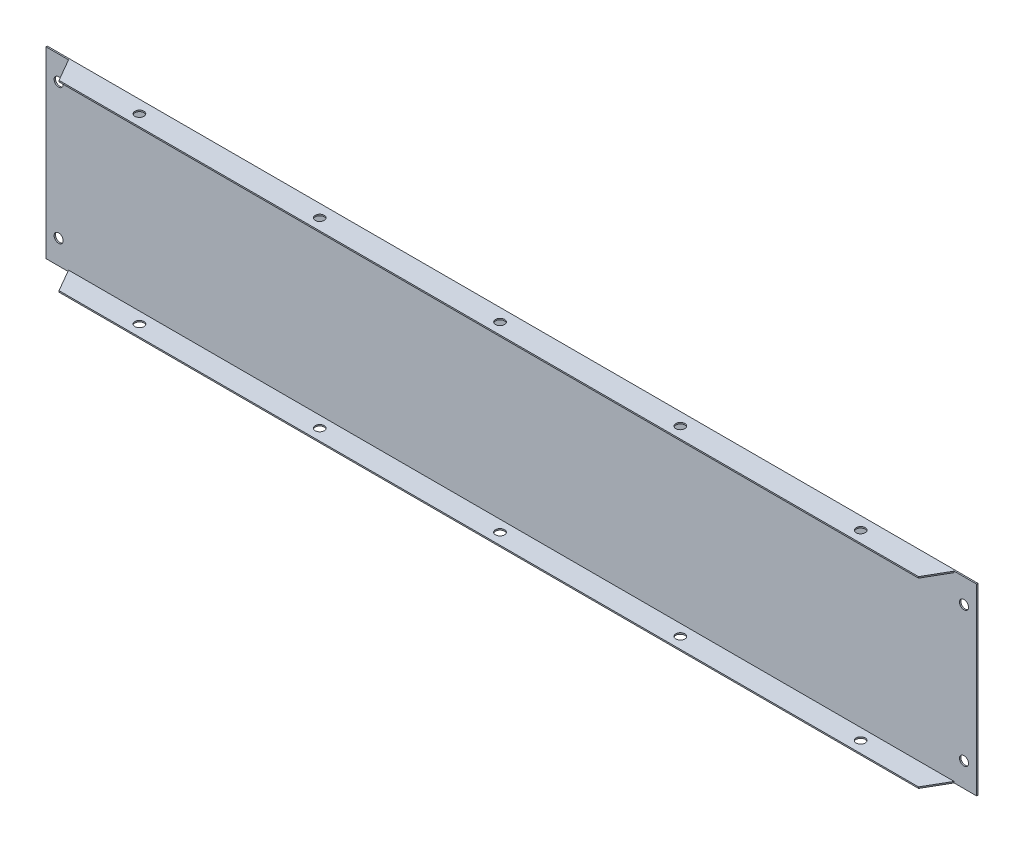
ISO-10303-21;
HEADER;
FILE_DESCRIPTION(('STEP AP214'),'2;1');
FILE_NAME('part.step','',(''),(''),'','','');
FILE_SCHEMA(('AUTOMOTIVE_DESIGN { 1 0 10303 214 1 1 1 1 }'));
ENDSEC;
DATA;
#1=APPLICATION_CONTEXT('core data for automotive mechanical design processes');
#2=APPLICATION_PROTOCOL_DEFINITION('international standard','automotive_design',2000,#1);
#3=PRODUCT_CONTEXT('',#1,'mechanical');
#4=PRODUCT('Part','Part','',(#3));
#5=PRODUCT_RELATED_PRODUCT_CATEGORY('part','',(#4));
#6=PRODUCT_DEFINITION_FORMATION('','',#4);
#7=PRODUCT_DEFINITION_CONTEXT('part definition',#1,'design');
#8=PRODUCT_DEFINITION('design','',#6,#7);
#9=PRODUCT_DEFINITION_SHAPE('','',#8);
#10=(LENGTH_UNIT() NAMED_UNIT(*) SI_UNIT(.MILLI.,.METRE.));
#11=(NAMED_UNIT(*) PLANE_ANGLE_UNIT() SI_UNIT($,.RADIAN.));
#12=(NAMED_UNIT(*) SI_UNIT($,.STERADIAN.) SOLID_ANGLE_UNIT());
#13=UNCERTAINTY_MEASURE_WITH_UNIT(LENGTH_MEASURE(1.E-05),#10,'distance_accuracy_value','');
#14=(GEOMETRIC_REPRESENTATION_CONTEXT(3) GLOBAL_UNCERTAINTY_ASSIGNED_CONTEXT((#13)) GLOBAL_UNIT_ASSIGNED_CONTEXT((#10,
#11,#12)) REPRESENTATION_CONTEXT('',''));
#15=CARTESIAN_POINT('',(0.,0.,0.));
#16=DIRECTION('',(0.,0.,1.));
#17=DIRECTION('',(1.,0.,0.));
#18=AXIS2_PLACEMENT_3D('',#15,#16,#17);
#19=CARTESIAN_POINT('',(447.55,0.,0.6));
#20=DIRECTION('',(1.,0.,0.));
#21=DIRECTION('',(0.,0.,-1.));
#22=AXIS2_PLACEMENT_3D('',#19,#20,#21);
#23=PLANE('',#22);
#24=DIRECTION('',(0.,-1.,0.));
#25=VECTOR('',#24,1.);
#26=CARTESIAN_POINT('',(447.55,0.,0.));
#27=LINE('',#26,#25);
#28=CARTESIAN_POINT('',(447.55,81.4,0.));
#29=VERTEX_POINT('',#28);
#30=CARTESIAN_POINT('',(447.55,0.,0.));
#31=VERTEX_POINT('',#30);
#32=EDGE_CURVE('E256',#29,#31,#27,.T.);
#33=ORIENTED_EDGE('',*,*,#32,.F.);
#34=DIRECTION('',(0.,0.,-1.));
#35=VECTOR('',#34,1.);
#36=CARTESIAN_POINT('',(447.55,81.4,0.6));
#37=LINE('',#36,#35);
#38=CARTESIAN_POINT('',(447.55,81.4,0.6));
#39=VERTEX_POINT('',#38);
#40=EDGE_CURVE('E11',#39,#29,#37,.T.);
#41=ORIENTED_EDGE('',*,*,#40,.F.);
#42=DIRECTION('',(0.,-1.,0.));
#43=VECTOR('',#42,1.);
#44=CARTESIAN_POINT('',(447.55,0.,0.6));
#45=LINE('',#44,#43);
#46=CARTESIAN_POINT('',(447.55,0.,0.6));
#47=VERTEX_POINT('',#46);
#48=EDGE_CURVE('E231',#39,#47,#45,.T.);
#49=ORIENTED_EDGE('',*,*,#48,.T.);
#50=DIRECTION('',(0.,0.,-1.));
#51=VECTOR('',#50,1.);
#52=CARTESIAN_POINT('',(447.55,0.,0.6));
#53=LINE('',#52,#51);
#54=EDGE_CURVE('E244',#47,#31,#53,.T.);
#55=ORIENTED_EDGE('',*,*,#54,.T.);
#56=EDGE_LOOP('',(#33,#41,#49,#55));
#57=FACE_BOUND('',#56,.T.);
#58=ADVANCED_FACE('F35',(#57),#23,.T.);
#59=CARTESIAN_POINT('',(0.,81.4,0.6));
#60=DIRECTION('',(0.,1.,0.));
#61=DIRECTION('',(0.,0.,1.));
#62=AXIS2_PLACEMENT_3D('',#59,#60,#61);
#63=PLANE('',#62);
#64=DIRECTION('',(1.,0.,0.));
#65=VECTOR('',#64,1.);
#66=CARTESIAN_POINT('',(0.,81.4,0.));
#67=LINE('',#66,#65);
#68=CARTESIAN_POINT('',(34.65,81.4,0.));
#69=VERTEX_POINT('',#68);
#70=EDGE_CURVE('E259',#69,#29,#67,.T.);
#71=ORIENTED_EDGE('',*,*,#70,.F.);
#72=DIRECTION('',(0.,0.,-1.));
#73=VECTOR('',#72,1.);
#74=CARTESIAN_POINT('',(34.65,81.4,0.6));
#75=LINE('',#74,#73);
#76=CARTESIAN_POINT('',(34.65,81.4,0.6));
#77=VERTEX_POINT('',#76);
#78=EDGE_CURVE('E43',#77,#69,#75,.T.);
#79=ORIENTED_EDGE('',*,*,#78,.F.);
#80=DIRECTION('',(1.,0.,0.));
#81=VECTOR('',#80,1.);
#82=CARTESIAN_POINT('',(0.,81.4,0.6));
#83=LINE('',#82,#81);
#84=CARTESIAN_POINT('',(44.65,81.4,0.6));
#85=VERTEX_POINT('',#84);
#86=EDGE_CURVE('E235',#77,#85,#83,.T.);
#87=ORIENTED_EDGE('',*,*,#86,.T.);
#88=DIRECTION('',(0.500000000000006,0.,0.866025403784435));
#89=VECTOR('',#88,1.);
#90=CARTESIAN_POINT('',(44.65,81.4,0.6));
#91=LINE('',#90,#89);
#92=CARTESIAN_POINT('',(50.4235026918964,81.4,10.6000000000001));
#93=VERTEX_POINT('',#92);
#94=EDGE_CURVE('E185',#85,#93,#91,.T.);
#95=ORIENTED_EDGE('',*,*,#94,.T.);
#96=DIRECTION('',(1.,0.,0.));
#97=VECTOR('',#96,1.);
#98=CARTESIAN_POINT('',(50.4235026918964,81.4,10.6000000000001));
#99=LINE('',#98,#97);
#100=CARTESIAN_POINT('',(431.776497308104,81.4,10.6));
#101=VERTEX_POINT('',#100);
#102=EDGE_CURVE('E204',#93,#101,#99,.T.);
#103=ORIENTED_EDGE('',*,*,#102,.T.);
#104=DIRECTION('',(0.500000000000004,0.,-0.866025403784436));
#105=VECTOR('',#104,1.);
#106=CARTESIAN_POINT('',(431.776497308104,81.4,10.6));
#107=LINE('',#106,#105);
#108=CARTESIAN_POINT('',(437.55,81.4,0.599999999999976));
#109=VERTEX_POINT('',#108);
#110=EDGE_CURVE('E192',#101,#109,#107,.T.);
#111=ORIENTED_EDGE('',*,*,#110,.T.);
#112=EDGE_CURVE('E234',#109,#39,#83,.T.);
#113=ORIENTED_EDGE('',*,*,#112,.T.);
#114=ORIENTED_EDGE('',*,*,#40,.T.);
#115=EDGE_LOOP('',(#71,#79,#87,#95,#103,#111,#113,#114));
#116=FACE_BOUND('',#115,.T.);
#117=CARTESIAN_POINT('',(81.1,81.4,5.60000000000224));
#118=DIRECTION('',(0.,1.,0.));
#119=DIRECTION('',(-1.,0.,0.));
#120=AXIS2_PLACEMENT_3D('',#117,#118,#119);
#121=CIRCLE('',#120,2.);
#122=CARTESIAN_POINT('',(79.1,81.4,5.60000000000224));
#123=VERTEX_POINT('',#122);
#124=EDGE_CURVE('E155',#123,#123,#121,.T.);
#125=ORIENTED_EDGE('',*,*,#124,.F.);
#126=EDGE_LOOP('',(#125));
#127=FACE_BOUND('',#126,.T.);
#128=CARTESIAN_POINT('',(161.1,81.4,5.60000000000168));
#129=DIRECTION('',(0.,1.,0.));
#130=DIRECTION('',(-1.,0.,0.));
#131=AXIS2_PLACEMENT_3D('',#128,#129,#130);
#132=CIRCLE('',#131,2.);
#133=CARTESIAN_POINT('',(159.1,81.4,5.60000000000168));
#134=VERTEX_POINT('',#133);
#135=EDGE_CURVE('E161',#134,#134,#132,.T.);
#136=ORIENTED_EDGE('',*,*,#135,.F.);
#137=EDGE_LOOP('',(#136));
#138=FACE_BOUND('',#137,.T.);
#139=CARTESIAN_POINT('',(241.1,81.4,5.60000000000112));
#140=DIRECTION('',(0.,1.,0.));
#141=DIRECTION('',(-1.,0.,0.));
#142=AXIS2_PLACEMENT_3D('',#139,#140,#141);
#143=CIRCLE('',#142,2.);
#144=CARTESIAN_POINT('',(239.1,81.4,5.60000000000112));
#145=VERTEX_POINT('',#144);
#146=EDGE_CURVE('E167',#145,#145,#143,.T.);
#147=ORIENTED_EDGE('',*,*,#146,.F.);
#148=EDGE_LOOP('',(#147));
#149=FACE_BOUND('',#148,.T.);
#150=CARTESIAN_POINT('',(321.1,81.4,5.60000000000056));
#151=DIRECTION('',(0.,1.,0.));
#152=DIRECTION('',(-1.,0.,0.));
#153=AXIS2_PLACEMENT_3D('',#150,#151,#152);
#154=CIRCLE('',#153,2.);
#155=CARTESIAN_POINT('',(319.1,81.4,5.60000000000056));
#156=VERTEX_POINT('',#155);
#157=EDGE_CURVE('E173',#156,#156,#154,.T.);
#158=ORIENTED_EDGE('',*,*,#157,.F.);
#159=EDGE_LOOP('',(#158));
#160=FACE_BOUND('',#159,.T.);
#161=CARTESIAN_POINT('',(401.1,81.4,5.6));
#162=DIRECTION('',(0.,1.,0.));
#163=DIRECTION('',(-1.,0.,0.));
#164=AXIS2_PLACEMENT_3D('',#161,#162,#163);
#165=CIRCLE('',#164,2.);
#166=CARTESIAN_POINT('',(399.1,81.4,5.6));
#167=VERTEX_POINT('',#166);
#168=EDGE_CURVE('E179',#167,#167,#165,.T.);
#169=ORIENTED_EDGE('',*,*,#168,.F.);
#170=EDGE_LOOP('',(#169));
#171=FACE_BOUND('',#170,.T.);
#172=ADVANCED_FACE('F280',(#116,#127,#138,#149,#160,#171),#63,.T.);
#173=CARTESIAN_POINT('',(34.65,0.,0.6));
#174=DIRECTION('',(1.,0.,0.));
#175=DIRECTION('',(0.,0.,-1.));
#176=AXIS2_PLACEMENT_3D('',#173,#174,#175);
#177=PLANE('',#176);
#178=DIRECTION('',(0.,-1.,0.));
#179=VECTOR('',#178,1.);
#180=CARTESIAN_POINT('',(34.65,0.,0.));
#181=LINE('',#180,#179);
#182=CARTESIAN_POINT('',(34.65,0.,0.));
#183=VERTEX_POINT('',#182);
#184=EDGE_CURVE('E262',#69,#183,#181,.T.);
#185=ORIENTED_EDGE('',*,*,#184,.T.);
#186=DIRECTION('',(0.,0.,-1.));
#187=VECTOR('',#186,1.);
#188=CARTESIAN_POINT('',(34.65,0.,0.6));
#189=LINE('',#188,#187);
#190=CARTESIAN_POINT('',(34.65,0.,0.6));
#191=VERTEX_POINT('',#190);
#192=EDGE_CURVE('E268',#191,#183,#189,.T.);
#193=ORIENTED_EDGE('',*,*,#192,.F.);
#194=DIRECTION('',(0.,-1.,0.));
#195=VECTOR('',#194,1.);
#196=CARTESIAN_POINT('',(34.65,0.,0.6));
#197=LINE('',#196,#195);
#198=EDGE_CURVE('E238',#77,#191,#197,.T.);
#199=ORIENTED_EDGE('',*,*,#198,.F.);
#200=ORIENTED_EDGE('',*,*,#78,.T.);
#201=EDGE_LOOP('',(#185,#193,#199,#200));
#202=FACE_BOUND('',#201,.T.);
#203=ADVANCED_FACE('F273',(#202),#177,.F.);
#204=CARTESIAN_POINT('',(40.25,70.7,0.6));
#205=DIRECTION('',(0.,0.,-1.));
#206=DIRECTION('',(-1.,0.,0.));
#207=AXIS2_PLACEMENT_3D('',#204,#205,#206);
#208=CYLINDRICAL_SURFACE('',#207,2.);
#209=CARTESIAN_POINT('',(40.25,70.7,0.6));
#210=DIRECTION('',(0.,0.,1.));
#211=DIRECTION('',(1.,0.,0.));
#212=AXIS2_PLACEMENT_3D('',#209,#210,#211);
#213=CIRCLE('',#212,2.);
#214=CARTESIAN_POINT('',(42.25,70.7,0.6));
#215=VERTEX_POINT('',#214);
#216=EDGE_CURVE('E228',#215,#215,#213,.T.);
#217=ORIENTED_EDGE('',*,*,#216,.T.);
#218=EDGE_LOOP('',(#217));
#219=FACE_BOUND('',#218,.T.);
#220=CARTESIAN_POINT('',(40.25,70.7,0.));
#221=DIRECTION('',(0.,0.,1.));
#222=DIRECTION('',(1.,0.,0.));
#223=AXIS2_PLACEMENT_3D('',#220,#221,#222);
#224=CIRCLE('',#223,2.);
#225=CARTESIAN_POINT('',(42.25,70.7,0.));
#226=VERTEX_POINT('',#225);
#227=EDGE_CURVE('E253',#226,#226,#224,.T.);
#228=ORIENTED_EDGE('',*,*,#227,.F.);
#229=EDGE_LOOP('',(#228));
#230=FACE_BOUND('',#229,.T.);
#231=ADVANCED_FACE('F330',(#219,#230),#208,.F.);
#232=CARTESIAN_POINT('',(441.95,70.7,0.6));
#233=DIRECTION('',(0.,0.,-1.));
#234=DIRECTION('',(-1.,0.,0.));
#235=AXIS2_PLACEMENT_3D('',#232,#233,#234);
#236=CYLINDRICAL_SURFACE('',#235,2.);
#237=CARTESIAN_POINT('',(441.95,70.7,0.6));
#238=DIRECTION('',(0.,0.,1.));
#239=DIRECTION('',(1.,0.,0.));
#240=AXIS2_PLACEMENT_3D('',#237,#238,#239);
#241=CIRCLE('',#240,2.);
#242=CARTESIAN_POINT('',(443.95,70.7,0.6));
#243=VERTEX_POINT('',#242);
#244=EDGE_CURVE('E225',#243,#243,#241,.T.);
#245=ORIENTED_EDGE('',*,*,#244,.T.);
#246=EDGE_LOOP('',(#245));
#247=FACE_BOUND('',#246,.T.);
#248=CARTESIAN_POINT('',(441.95,70.7,0.));
#249=DIRECTION('',(0.,0.,1.));
#250=DIRECTION('',(1.,0.,0.));
#251=AXIS2_PLACEMENT_3D('',#248,#249,#250);
#252=CIRCLE('',#251,2.);
#253=CARTESIAN_POINT('',(443.95,70.7,0.));
#254=VERTEX_POINT('',#253);
#255=EDGE_CURVE('E250',#254,#254,#252,.T.);
#256=ORIENTED_EDGE('',*,*,#255,.F.);
#257=EDGE_LOOP('',(#256));
#258=FACE_BOUND('',#257,.T.);
#259=ADVANCED_FACE('F333',(#247,#258),#236,.F.);
#260=CARTESIAN_POINT('',(441.95,10.7,0.6));
#261=DIRECTION('',(0.,0.,-1.));
#262=DIRECTION('',(-1.,0.,0.));
#263=AXIS2_PLACEMENT_3D('',#260,#261,#262);
#264=CYLINDRICAL_SURFACE('',#263,2.);
#265=CARTESIAN_POINT('',(441.95,10.7,0.6));
#266=DIRECTION('',(0.,0.,1.));
#267=DIRECTION('',(1.,0.,0.));
#268=AXIS2_PLACEMENT_3D('',#265,#266,#267);
#269=CIRCLE('',#268,2.);
#270=CARTESIAN_POINT('',(443.95,10.7,0.6));
#271=VERTEX_POINT('',#270);
#272=EDGE_CURVE('E221',#271,#271,#269,.T.);
#273=ORIENTED_EDGE('',*,*,#272,.T.);
#274=EDGE_LOOP('',(#273));
#275=FACE_BOUND('',#274,.T.);
#276=CARTESIAN_POINT('',(441.95,10.7,0.));
#277=DIRECTION('',(0.,0.,1.));
#278=DIRECTION('',(1.,0.,0.));
#279=AXIS2_PLACEMENT_3D('',#276,#277,#278);
#280=CIRCLE('',#279,2.);
#281=CARTESIAN_POINT('',(443.95,10.7,0.));
#282=VERTEX_POINT('',#281);
#283=EDGE_CURVE('E247',#282,#282,#280,.T.);
#284=ORIENTED_EDGE('',*,*,#283,.F.);
#285=EDGE_LOOP('',(#284));
#286=FACE_BOUND('',#285,.T.);
#287=ADVANCED_FACE('F336',(#275,#286),#264,.F.);
#288=CARTESIAN_POINT('',(40.25,10.7,0.6));
#289=DIRECTION('',(0.,0.,-1.));
#290=DIRECTION('',(-1.,0.,0.));
#291=AXIS2_PLACEMENT_3D('',#288,#289,#290);
#292=CYLINDRICAL_SURFACE('',#291,2.);
#293=CARTESIAN_POINT('',(40.25,10.7,0.6));
#294=DIRECTION('',(0.,0.,1.));
#295=DIRECTION('',(1.,0.,0.));
#296=AXIS2_PLACEMENT_3D('',#293,#294,#295);
#297=CIRCLE('',#296,2.);
#298=CARTESIAN_POINT('',(42.25,10.7,0.6));
#299=VERTEX_POINT('',#298);
#300=EDGE_CURVE('E218',#299,#299,#297,.T.);
#301=ORIENTED_EDGE('',*,*,#300,.T.);
#302=EDGE_LOOP('',(#301));
#303=FACE_BOUND('',#302,.T.);
#304=CARTESIAN_POINT('',(40.25,10.7,0.));
#305=DIRECTION('',(0.,0.,1.));
#306=DIRECTION('',(1.,0.,0.));
#307=AXIS2_PLACEMENT_3D('',#304,#305,#306);
#308=CIRCLE('',#307,2.);
#309=CARTESIAN_POINT('',(42.25,10.7,0.));
#310=VERTEX_POINT('',#309);
#311=EDGE_CURVE('E211',#310,#310,#308,.T.);
#312=ORIENTED_EDGE('',*,*,#311,.F.);
#313=EDGE_LOOP('',(#312));
#314=FACE_BOUND('',#313,.T.);
#315=ADVANCED_FACE('F37',(#303,#314),#292,.F.);
#316=CARTESIAN_POINT('',(0.,0.,0.6));
#317=DIRECTION('',(0.,1.,0.));
#318=DIRECTION('',(0.,0.,1.));
#319=AXIS2_PLACEMENT_3D('',#316,#317,#318);
#320=PLANE('',#319);
#321=DIRECTION('',(1.,0.,0.));
#322=VECTOR('',#321,1.);
#323=CARTESIAN_POINT('',(0.,0.,0.));
#324=LINE('',#323,#322);
#325=EDGE_CURVE('E222',#183,#31,#324,.T.);
#326=ORIENTED_EDGE('',*,*,#325,.T.);
#327=ORIENTED_EDGE('',*,*,#54,.F.);
#328=DIRECTION('',(1.,0.,0.));
#329=VECTOR('',#328,1.);
#330=CARTESIAN_POINT('',(0.,0.,0.6));
#331=LINE('',#330,#329);
#332=CARTESIAN_POINT('',(437.55,0.,0.599999999999976));
#333=VERTEX_POINT('',#332);
#334=EDGE_CURVE('E241',#333,#47,#331,.T.);
#335=ORIENTED_EDGE('',*,*,#334,.F.);
#336=DIRECTION('',(-0.500000000000004,0.,0.866025403784436));
#337=VECTOR('',#336,1.);
#338=CARTESIAN_POINT('',(437.55,0.,0.599999999999976));
#339=LINE('',#338,#337);
#340=CARTESIAN_POINT('',(431.776497308104,0.,10.6));
#341=VERTEX_POINT('',#340);
#342=EDGE_CURVE('E151',#333,#341,#339,.T.);
#343=ORIENTED_EDGE('',*,*,#342,.T.);
#344=DIRECTION('',(-1.,0.,0.));
#345=VECTOR('',#344,1.);
#346=CARTESIAN_POINT('',(431.776497308104,0.,10.6));
#347=LINE('',#346,#345);
#348=CARTESIAN_POINT('',(50.4235026918964,0.,10.6000000000001));
#349=VERTEX_POINT('',#348);
#350=EDGE_CURVE('E128',#341,#349,#347,.T.);
#351=ORIENTED_EDGE('',*,*,#350,.T.);
#352=DIRECTION('',(-0.500000000000006,0.,-0.866025403784435));
#353=VECTOR('',#352,1.);
#354=CARTESIAN_POINT('',(50.4235026918964,0.,10.6000000000001));
#355=LINE('',#354,#353);
#356=CARTESIAN_POINT('',(44.65,0.,0.6));
#357=VERTEX_POINT('',#356);
#358=EDGE_CURVE('E148',#349,#357,#355,.T.);
#359=ORIENTED_EDGE('',*,*,#358,.T.);
#360=EDGE_CURVE('E242',#191,#357,#331,.T.);
#361=ORIENTED_EDGE('',*,*,#360,.F.);
#362=ORIENTED_EDGE('',*,*,#192,.T.);
#363=EDGE_LOOP('',(#326,#327,#335,#343,#351,#359,#361,#362));
#364=FACE_BOUND('',#363,.T.);
#365=CARTESIAN_POINT('',(81.1,0.,5.60000000000224));
#366=DIRECTION('',(0.,-1.,0.));
#367=DIRECTION('',(0.,0.,-1.));
#368=AXIS2_PLACEMENT_3D('',#365,#366,#367);
#369=CIRCLE('',#368,2.);
#370=CARTESIAN_POINT('',(81.1,0.,3.60000000000224));
#371=VERTEX_POINT('',#370);
#372=EDGE_CURVE('E574',#371,#371,#369,.T.);
#373=ORIENTED_EDGE('',*,*,#372,.F.);
#374=EDGE_LOOP('',(#373));
#375=FACE_BOUND('',#374,.T.);
#376=CARTESIAN_POINT('',(161.1,0.,5.60000000000168));
#377=DIRECTION('',(0.,-1.,0.));
#378=DIRECTION('',(0.,0.,-1.));
#379=AXIS2_PLACEMENT_3D('',#376,#377,#378);
#380=CIRCLE('',#379,2.);
#381=CARTESIAN_POINT('',(161.1,0.,3.60000000000168));
#382=VERTEX_POINT('',#381);
#383=EDGE_CURVE('E576',#382,#382,#380,.T.);
#384=ORIENTED_EDGE('',*,*,#383,.F.);
#385=EDGE_LOOP('',(#384));
#386=FACE_BOUND('',#385,.T.);
#387=CARTESIAN_POINT('',(241.1,0.,5.60000000000112));
#388=DIRECTION('',(0.,-1.,0.));
#389=DIRECTION('',(0.,0.,-1.));
#390=AXIS2_PLACEMENT_3D('',#387,#388,#389);
#391=CIRCLE('',#390,2.);
#392=CARTESIAN_POINT('',(241.1,0.,3.60000000000113));
#393=VERTEX_POINT('',#392);
#394=EDGE_CURVE('E582',#393,#393,#391,.T.);
#395=ORIENTED_EDGE('',*,*,#394,.F.);
#396=EDGE_LOOP('',(#395));
#397=FACE_BOUND('',#396,.T.);
#398=CARTESIAN_POINT('',(321.1,0.,5.60000000000056));
#399=DIRECTION('',(0.,-1.,0.));
#400=DIRECTION('',(0.,0.,-1.));
#401=AXIS2_PLACEMENT_3D('',#398,#399,#400);
#402=CIRCLE('',#401,2.);
#403=CARTESIAN_POINT('',(321.1,0.,3.60000000000057));
#404=VERTEX_POINT('',#403);
#405=EDGE_CURVE('E588',#404,#404,#402,.T.);
#406=ORIENTED_EDGE('',*,*,#405,.F.);
#407=EDGE_LOOP('',(#406));
#408=FACE_BOUND('',#407,.T.);
#409=CARTESIAN_POINT('',(401.1,0.,5.6));
#410=DIRECTION('',(0.,-1.,0.));
#411=DIRECTION('',(0.,0.,-1.));
#412=AXIS2_PLACEMENT_3D('',#409,#410,#411);
#413=CIRCLE('',#412,2.);
#414=CARTESIAN_POINT('',(401.1,0.,3.60000000000001));
#415=VERTEX_POINT('',#414);
#416=EDGE_CURVE('E594',#415,#415,#413,.T.);
#417=ORIENTED_EDGE('',*,*,#416,.F.);
#418=EDGE_LOOP('',(#417));
#419=FACE_BOUND('',#418,.T.);
#420=ADVANCED_FACE('F289',(#364,#375,#386,#397,#408,#419),#320,.F.);
#421=CARTESIAN_POINT('',(0.,0.,0.6));
#422=DIRECTION('',(0.,0.,1.));
#423=DIRECTION('',(1.,0.,0.));
#424=AXIS2_PLACEMENT_3D('',#421,#422,#423);
#425=PLANE('',#424);
#426=DIRECTION('',(0.,-1.,0.));
#427=VECTOR('',#426,1.);
#428=CARTESIAN_POINT('',(44.65,0.6,0.6));
#429=LINE('',#428,#427);
#430=CARTESIAN_POINT('',(44.65,0.6,0.6));
#431=VERTEX_POINT('',#430);
#432=EDGE_CURVE('E55',#431,#357,#429,.T.);
#433=ORIENTED_EDGE('',*,*,#432,.F.);
#434=DIRECTION('',(1.,0.,0.));
#435=VECTOR('',#434,1.);
#436=CARTESIAN_POINT('',(44.65,0.6,0.6));
#437=LINE('',#436,#435);
#438=CARTESIAN_POINT('',(437.55,0.6,0.6));
#439=VERTEX_POINT('',#438);
#440=EDGE_CURVE('E50',#431,#439,#437,.T.);
#441=ORIENTED_EDGE('',*,*,#440,.T.);
#442=DIRECTION('',(0.,-1.,0.));
#443=VECTOR('',#442,1.);
#444=CARTESIAN_POINT('',(437.55,0.6,0.599999999999976));
#445=LINE('',#444,#443);
#446=EDGE_CURVE('E133',#439,#333,#445,.T.);
#447=ORIENTED_EDGE('',*,*,#446,.T.);
#448=ORIENTED_EDGE('',*,*,#334,.T.);
#449=ORIENTED_EDGE('',*,*,#48,.F.);
#450=ORIENTED_EDGE('',*,*,#112,.F.);
#451=DIRECTION('',(0.,1.,0.));
#452=VECTOR('',#451,1.);
#453=CARTESIAN_POINT('',(437.55,80.8,0.599999999999976));
#454=LINE('',#453,#452);
#455=CARTESIAN_POINT('',(437.55,80.8,0.599999999999976));
#456=VERTEX_POINT('',#455);
#457=EDGE_CURVE('E209',#456,#109,#454,.T.);
#458=ORIENTED_EDGE('',*,*,#457,.F.);
#459=DIRECTION('',(-1.,0.,0.));
#460=VECTOR('',#459,1.);
#461=CARTESIAN_POINT('',(437.55,80.8,0.599999999999976));
#462=LINE('',#461,#460);
#463=CARTESIAN_POINT('',(44.65,80.8,0.6));
#464=VERTEX_POINT('',#463);
#465=EDGE_CURVE('E188',#456,#464,#462,.T.);
#466=ORIENTED_EDGE('',*,*,#465,.T.);
#467=DIRECTION('',(0.,1.,0.));
#468=VECTOR('',#467,1.);
#469=CARTESIAN_POINT('',(44.65,80.8,0.6));
#470=LINE('',#469,#468);
#471=EDGE_CURVE('E201',#464,#85,#470,.T.);
#472=ORIENTED_EDGE('',*,*,#471,.T.);
#473=ORIENTED_EDGE('',*,*,#86,.F.);
#474=ORIENTED_EDGE('',*,*,#198,.T.);
#475=ORIENTED_EDGE('',*,*,#360,.T.);
#476=EDGE_LOOP('',(#433,#441,#447,#448,#449,#450,#458,#466,#472,#473,#474,#475));
#477=FACE_BOUND('',#476,.T.);
#478=ORIENTED_EDGE('',*,*,#300,.F.);
#479=EDGE_LOOP('',(#478));
#480=FACE_BOUND('',#479,.T.);
#481=ORIENTED_EDGE('',*,*,#272,.F.);
#482=EDGE_LOOP('',(#481));
#483=FACE_BOUND('',#482,.T.);
#484=ORIENTED_EDGE('',*,*,#244,.F.);
#485=EDGE_LOOP('',(#484));
#486=FACE_BOUND('',#485,.T.);
#487=ORIENTED_EDGE('',*,*,#216,.F.);
#488=EDGE_LOOP('',(#487));
#489=FACE_BOUND('',#488,.T.);
#490=ADVANCED_FACE('F292',(#477,#480,#483,#486,#489),#425,.T.);
#491=CARTESIAN_POINT('',(0.,0.,0.));
#492=DIRECTION('',(0.,0.,1.));
#493=DIRECTION('',(1.,0.,0.));
#494=AXIS2_PLACEMENT_3D('',#491,#492,#493);
#495=PLANE('',#494);
#496=ORIENTED_EDGE('',*,*,#311,.T.);
#497=EDGE_LOOP('',(#496));
#498=FACE_BOUND('',#497,.T.);
#499=ORIENTED_EDGE('',*,*,#283,.T.);
#500=EDGE_LOOP('',(#499));
#501=FACE_BOUND('',#500,.T.);
#502=ORIENTED_EDGE('',*,*,#255,.T.);
#503=EDGE_LOOP('',(#502));
#504=FACE_BOUND('',#503,.T.);
#505=ORIENTED_EDGE('',*,*,#227,.T.);
#506=EDGE_LOOP('',(#505));
#507=FACE_BOUND('',#506,.T.);
#508=ORIENTED_EDGE('',*,*,#32,.T.);
#509=ORIENTED_EDGE('',*,*,#325,.F.);
#510=ORIENTED_EDGE('',*,*,#184,.F.);
#511=ORIENTED_EDGE('',*,*,#70,.T.);
#512=EDGE_LOOP('',(#508,#509,#510,#511));
#513=FACE_BOUND('',#512,.T.);
#514=ADVANCED_FACE('F279',(#498,#501,#504,#507,#513),#495,.F.);
#515=CARTESIAN_POINT('',(431.776497308104,80.8,10.6));
#516=DIRECTION('',(0.866025403784436,0.,0.500000000000004));
#517=DIRECTION('',(0.500000000000004,0.,-0.866025403784436));
#518=AXIS2_PLACEMENT_3D('',#515,#516,#517);
#519=PLANE('',#518);
#520=ORIENTED_EDGE('',*,*,#110,.F.);
#521=DIRECTION('',(0.,1.,0.));
#522=VECTOR('',#521,1.);
#523=CARTESIAN_POINT('',(431.776497308104,80.8,10.6));
#524=LINE('',#523,#522);
#525=CARTESIAN_POINT('',(431.776497308104,80.8,10.6));
#526=VERTEX_POINT('',#525);
#527=EDGE_CURVE('E212',#526,#101,#524,.T.);
#528=ORIENTED_EDGE('',*,*,#527,.F.);
#529=DIRECTION('',(0.500000000000004,0.,-0.866025403784436));
#530=VECTOR('',#529,1.);
#531=CARTESIAN_POINT('',(431.776497308104,80.8,10.6));
#532=LINE('',#531,#530);
#533=EDGE_CURVE('E198',#526,#456,#532,.T.);
#534=ORIENTED_EDGE('',*,*,#533,.T.);
#535=ORIENTED_EDGE('',*,*,#457,.T.);
#536=EDGE_LOOP('',(#520,#528,#534,#535));
#537=FACE_BOUND('',#536,.T.);
#538=ADVANCED_FACE('F304',(#537),#519,.T.);
#539=CARTESIAN_POINT('',(50.4235026918964,80.8,10.6000000000001));
#540=DIRECTION('',(0.,0.,1.));
#541=DIRECTION('',(1.,0.,0.));
#542=AXIS2_PLACEMENT_3D('',#539,#540,#541);
#543=PLANE('',#542);
#544=ORIENTED_EDGE('',*,*,#102,.F.);
#545=DIRECTION('',(0.,1.,0.));
#546=VECTOR('',#545,1.);
#547=CARTESIAN_POINT('',(50.4235026918964,80.8,10.6000000000001));
#548=LINE('',#547,#546);
#549=CARTESIAN_POINT('',(50.4235026918964,80.8,10.6000000000001));
#550=VERTEX_POINT('',#549);
#551=EDGE_CURVE('E214',#550,#93,#548,.T.);
#552=ORIENTED_EDGE('',*,*,#551,.F.);
#553=DIRECTION('',(1.,0.,0.));
#554=VECTOR('',#553,1.);
#555=CARTESIAN_POINT('',(50.4235026918964,80.8,10.6000000000001));
#556=LINE('',#555,#554);
#557=EDGE_CURVE('E195',#550,#526,#556,.T.);
#558=ORIENTED_EDGE('',*,*,#557,.T.);
#559=ORIENTED_EDGE('',*,*,#527,.T.);
#560=EDGE_LOOP('',(#544,#552,#558,#559));
#561=FACE_BOUND('',#560,.T.);
#562=ADVANCED_FACE('F301',(#561),#543,.T.);
#563=CARTESIAN_POINT('',(44.65,80.8,0.6));
#564=DIRECTION('',(-0.866025403784435,0.,0.500000000000006));
#565=DIRECTION('',(0.500000000000006,0.,0.866025403784435));
#566=AXIS2_PLACEMENT_3D('',#563,#564,#565);
#567=PLANE('',#566);
#568=ORIENTED_EDGE('',*,*,#94,.F.);
#569=ORIENTED_EDGE('',*,*,#471,.F.);
#570=DIRECTION('',(0.500000000000006,0.,0.866025403784435));
#571=VECTOR('',#570,1.);
#572=CARTESIAN_POINT('',(44.65,80.8,0.6));
#573=LINE('',#572,#571);
#574=EDGE_CURVE('E191',#464,#550,#573,.T.);
#575=ORIENTED_EDGE('',*,*,#574,.T.);
#576=ORIENTED_EDGE('',*,*,#551,.T.);
#577=EDGE_LOOP('',(#568,#569,#575,#576));
#578=FACE_BOUND('',#577,.T.);
#579=ADVANCED_FACE('F297',(#578),#567,.T.);
#580=CARTESIAN_POINT('',(0.,80.8,0.));
#581=DIRECTION('',(0.,1.,0.));
#582=DIRECTION('',(-1.,0.,0.));
#583=AXIS2_PLACEMENT_3D('',#580,#581,#582);
#584=PLANE('',#583);
#585=CARTESIAN_POINT('',(81.1,80.8,5.60000000000224));
#586=DIRECTION('',(0.,1.,0.));
#587=DIRECTION('',(-1.,0.,0.));
#588=AXIS2_PLACEMENT_3D('',#585,#586,#587);
#589=CIRCLE('',#588,2.);
#590=CARTESIAN_POINT('',(79.1,80.8,5.60000000000224));
#591=VERTEX_POINT('',#590);
#592=EDGE_CURVE('E158',#591,#591,#589,.T.);
#593=ORIENTED_EDGE('',*,*,#592,.T.);
#594=EDGE_LOOP('',(#593));
#595=FACE_BOUND('',#594,.T.);
#596=CARTESIAN_POINT('',(161.1,80.8,5.60000000000168));
#597=DIRECTION('',(0.,1.,0.));
#598=DIRECTION('',(-1.,0.,0.));
#599=AXIS2_PLACEMENT_3D('',#596,#597,#598);
#600=CIRCLE('',#599,2.);
#601=CARTESIAN_POINT('',(159.1,80.8,5.60000000000168));
#602=VERTEX_POINT('',#601);
#603=EDGE_CURVE('E164',#602,#602,#600,.T.);
#604=ORIENTED_EDGE('',*,*,#603,.T.);
#605=EDGE_LOOP('',(#604));
#606=FACE_BOUND('',#605,.T.);
#607=CARTESIAN_POINT('',(241.1,80.8,5.60000000000112));
#608=DIRECTION('',(0.,1.,0.));
#609=DIRECTION('',(-1.,0.,0.));
#610=AXIS2_PLACEMENT_3D('',#607,#608,#609);
#611=CIRCLE('',#610,2.);
#612=CARTESIAN_POINT('',(239.1,80.8,5.60000000000112));
#613=VERTEX_POINT('',#612);
#614=EDGE_CURVE('E170',#613,#613,#611,.T.);
#615=ORIENTED_EDGE('',*,*,#614,.T.);
#616=EDGE_LOOP('',(#615));
#617=FACE_BOUND('',#616,.T.);
#618=CARTESIAN_POINT('',(321.1,80.8,5.60000000000056));
#619=DIRECTION('',(0.,1.,0.));
#620=DIRECTION('',(-1.,0.,0.));
#621=AXIS2_PLACEMENT_3D('',#618,#619,#620);
#622=CIRCLE('',#621,2.);
#623=CARTESIAN_POINT('',(319.1,80.8,5.60000000000056));
#624=VERTEX_POINT('',#623);
#625=EDGE_CURVE('E176',#624,#624,#622,.T.);
#626=ORIENTED_EDGE('',*,*,#625,.T.);
#627=EDGE_LOOP('',(#626));
#628=FACE_BOUND('',#627,.T.);
#629=CARTESIAN_POINT('',(401.1,80.8,5.6));
#630=DIRECTION('',(0.,1.,0.));
#631=DIRECTION('',(-1.,0.,0.));
#632=AXIS2_PLACEMENT_3D('',#629,#630,#631);
#633=CIRCLE('',#632,2.);
#634=CARTESIAN_POINT('',(399.1,80.8,5.6));
#635=VERTEX_POINT('',#634);
#636=EDGE_CURVE('E182',#635,#635,#633,.T.);
#637=ORIENTED_EDGE('',*,*,#636,.T.);
#638=EDGE_LOOP('',(#637));
#639=FACE_BOUND('',#638,.T.);
#640=ORIENTED_EDGE('',*,*,#465,.F.);
#641=ORIENTED_EDGE('',*,*,#533,.F.);
#642=ORIENTED_EDGE('',*,*,#557,.F.);
#643=ORIENTED_EDGE('',*,*,#574,.F.);
#644=EDGE_LOOP('',(#640,#641,#642,#643));
#645=FACE_BOUND('',#644,.T.);
#646=ADVANCED_FACE('F307',(#595,#606,#617,#628,#639,#645),#584,.F.);
#647=CARTESIAN_POINT('',(401.1,80.8,5.6));
#648=DIRECTION('',(0.,1.,0.));
#649=DIRECTION('',(-1.,0.,0.));
#650=AXIS2_PLACEMENT_3D('',#647,#648,#649);
#651=CYLINDRICAL_SURFACE('',#650,2.);
#652=ORIENTED_EDGE('',*,*,#636,.F.);
#653=EDGE_LOOP('',(#652));
#654=FACE_BOUND('',#653,.T.);
#655=ORIENTED_EDGE('',*,*,#168,.T.);
#656=EDGE_LOOP('',(#655));
#657=FACE_BOUND('',#656,.T.);
#658=ADVANCED_FACE('F309',(#654,#657),#651,.F.);
#659=CARTESIAN_POINT('',(321.1,80.8,5.60000000000056));
#660=DIRECTION('',(0.,1.,0.));
#661=DIRECTION('',(-1.,0.,0.));
#662=AXIS2_PLACEMENT_3D('',#659,#660,#661);
#663=CYLINDRICAL_SURFACE('',#662,2.);
#664=ORIENTED_EDGE('',*,*,#625,.F.);
#665=EDGE_LOOP('',(#664));
#666=FACE_BOUND('',#665,.T.);
#667=ORIENTED_EDGE('',*,*,#157,.T.);
#668=EDGE_LOOP('',(#667));
#669=FACE_BOUND('',#668,.T.);
#670=ADVANCED_FACE('F316',(#666,#669),#663,.F.);
#671=CARTESIAN_POINT('',(241.1,80.8,5.60000000000112));
#672=DIRECTION('',(0.,1.,0.));
#673=DIRECTION('',(-1.,0.,0.));
#674=AXIS2_PLACEMENT_3D('',#671,#672,#673);
#675=CYLINDRICAL_SURFACE('',#674,2.);
#676=ORIENTED_EDGE('',*,*,#614,.F.);
#677=EDGE_LOOP('',(#676));
#678=FACE_BOUND('',#677,.T.);
#679=ORIENTED_EDGE('',*,*,#146,.T.);
#680=EDGE_LOOP('',(#679));
#681=FACE_BOUND('',#680,.T.);
#682=ADVANCED_FACE('F437',(#678,#681),#675,.F.);
#683=CARTESIAN_POINT('',(161.1,80.8,5.60000000000168));
#684=DIRECTION('',(0.,1.,0.));
#685=DIRECTION('',(-1.,0.,0.));
#686=AXIS2_PLACEMENT_3D('',#683,#684,#685);
#687=CYLINDRICAL_SURFACE('',#686,2.);
#688=ORIENTED_EDGE('',*,*,#603,.F.);
#689=EDGE_LOOP('',(#688));
#690=FACE_BOUND('',#689,.T.);
#691=ORIENTED_EDGE('',*,*,#135,.T.);
#692=EDGE_LOOP('',(#691));
#693=FACE_BOUND('',#692,.T.);
#694=ADVANCED_FACE('F447',(#690,#693),#687,.F.);
#695=CARTESIAN_POINT('',(81.1,80.8,5.60000000000224));
#696=DIRECTION('',(0.,1.,0.));
#697=DIRECTION('',(-1.,0.,0.));
#698=AXIS2_PLACEMENT_3D('',#695,#696,#697);
#699=CYLINDRICAL_SURFACE('',#698,2.);
#700=ORIENTED_EDGE('',*,*,#592,.F.);
#701=EDGE_LOOP('',(#700));
#702=FACE_BOUND('',#701,.T.);
#703=ORIENTED_EDGE('',*,*,#124,.T.);
#704=EDGE_LOOP('',(#703));
#705=FACE_BOUND('',#704,.T.);
#706=ADVANCED_FACE('F457',(#702,#705),#699,.F.);
#707=CARTESIAN_POINT('',(50.4235026918964,0.6,10.6000000000001));
#708=DIRECTION('',(-0.866025403784435,0.,0.500000000000006));
#709=DIRECTION('',(0.500000000000006,0.,0.866025403784435));
#710=AXIS2_PLACEMENT_3D('',#707,#708,#709);
#711=PLANE('',#710);
#712=ORIENTED_EDGE('',*,*,#358,.F.);
#713=DIRECTION('',(0.,-1.,0.));
#714=VECTOR('',#713,1.);
#715=CARTESIAN_POINT('',(50.4235026918964,0.6,10.6000000000001));
#716=LINE('',#715,#714);
#717=CARTESIAN_POINT('',(50.4235026918964,0.6,10.6000000000001));
#718=VERTEX_POINT('',#717);
#719=EDGE_CURVE('E132',#718,#349,#716,.T.);
#720=ORIENTED_EDGE('',*,*,#719,.F.);
#721=DIRECTION('',(-0.500000000000006,0.,-0.866025403784435));
#722=VECTOR('',#721,1.);
#723=CARTESIAN_POINT('',(50.4235026918964,0.6,10.6000000000001));
#724=LINE('',#723,#722);
#725=EDGE_CURVE('E143',#718,#431,#724,.T.);
#726=ORIENTED_EDGE('',*,*,#725,.T.);
#727=ORIENTED_EDGE('',*,*,#432,.T.);
#728=EDGE_LOOP('',(#712,#720,#726,#727));
#729=FACE_BOUND('',#728,.T.);
#730=ADVANCED_FACE('F467',(#729),#711,.T.);
#731=CARTESIAN_POINT('',(431.776497308104,0.6,10.6));
#732=DIRECTION('',(0.,0.,1.));
#733=DIRECTION('',(1.,0.,0.));
#734=AXIS2_PLACEMENT_3D('',#731,#732,#733);
#735=PLANE('',#734);
#736=ORIENTED_EDGE('',*,*,#350,.F.);
#737=DIRECTION('',(0.,-1.,0.));
#738=VECTOR('',#737,1.);
#739=CARTESIAN_POINT('',(431.776497308104,0.6,10.6));
#740=LINE('',#739,#738);
#741=CARTESIAN_POINT('',(431.776497308104,0.6,10.6));
#742=VERTEX_POINT('',#741);
#743=EDGE_CURVE('E122',#742,#341,#740,.T.);
#744=ORIENTED_EDGE('',*,*,#743,.F.);
#745=DIRECTION('',(-1.,0.,0.));
#746=VECTOR('',#745,1.);
#747=CARTESIAN_POINT('',(431.776497308104,0.6,10.6));
#748=LINE('',#747,#746);
#749=EDGE_CURVE('E126',#742,#718,#748,.T.);
#750=ORIENTED_EDGE('',*,*,#749,.T.);
#751=ORIENTED_EDGE('',*,*,#719,.T.);
#752=EDGE_LOOP('',(#736,#744,#750,#751));
#753=FACE_BOUND('',#752,.T.);
#754=ADVANCED_FACE('F124',(#753),#735,.T.);
#755=CARTESIAN_POINT('',(437.55,0.6,0.599999999999976));
#756=DIRECTION('',(0.866025403784436,0.,0.500000000000004));
#757=DIRECTION('',(0.500000000000004,0.,-0.866025403784436));
#758=AXIS2_PLACEMENT_3D('',#755,#756,#757);
#759=PLANE('',#758);
#760=ORIENTED_EDGE('',*,*,#342,.F.);
#761=ORIENTED_EDGE('',*,*,#446,.F.);
#762=DIRECTION('',(-0.500000000000004,0.,0.866025403784436));
#763=VECTOR('',#762,1.);
#764=CARTESIAN_POINT('',(437.55,0.6,0.599999999999976));
#765=LINE('',#764,#763);
#766=EDGE_CURVE('E136',#439,#742,#765,.T.);
#767=ORIENTED_EDGE('',*,*,#766,.T.);
#768=ORIENTED_EDGE('',*,*,#743,.T.);
#769=EDGE_LOOP('',(#760,#761,#767,#768));
#770=FACE_BOUND('',#769,.T.);
#771=ADVANCED_FACE('F137',(#770),#759,.T.);
#772=CARTESIAN_POINT('',(0.,0.6,0.));
#773=DIRECTION('',(0.,-1.,0.));
#774=DIRECTION('',(0.,0.,-1.));
#775=AXIS2_PLACEMENT_3D('',#772,#773,#774);
#776=PLANE('',#775);
#777=CARTESIAN_POINT('',(81.1,0.6,5.60000000000224));
#778=DIRECTION('',(0.,-1.,0.));
#779=DIRECTION('',(0.,0.,-1.));
#780=AXIS2_PLACEMENT_3D('',#777,#778,#779);
#781=CIRCLE('',#780,2.);
#782=CARTESIAN_POINT('',(81.1,0.6,3.60000000000224));
#783=VERTEX_POINT('',#782);
#784=EDGE_CURVE('E571',#783,#783,#781,.T.);
#785=ORIENTED_EDGE('',*,*,#784,.T.);
#786=EDGE_LOOP('',(#785));
#787=FACE_BOUND('',#786,.T.);
#788=CARTESIAN_POINT('',(161.1,0.6,5.60000000000168));
#789=DIRECTION('',(0.,-1.,0.));
#790=DIRECTION('',(0.,0.,-1.));
#791=AXIS2_PLACEMENT_3D('',#788,#789,#790);
#792=CIRCLE('',#791,2.);
#793=CARTESIAN_POINT('',(161.1,0.6,3.60000000000168));
#794=VERTEX_POINT('',#793);
#795=EDGE_CURVE('E579',#794,#794,#792,.T.);
#796=ORIENTED_EDGE('',*,*,#795,.T.);
#797=EDGE_LOOP('',(#796));
#798=FACE_BOUND('',#797,.T.);
#799=CARTESIAN_POINT('',(241.1,0.6,5.60000000000112));
#800=DIRECTION('',(0.,-1.,0.));
#801=DIRECTION('',(0.,0.,-1.));
#802=AXIS2_PLACEMENT_3D('',#799,#800,#801);
#803=CIRCLE('',#802,2.);
#804=CARTESIAN_POINT('',(241.1,0.6,3.60000000000113));
#805=VERTEX_POINT('',#804);
#806=EDGE_CURVE('E585',#805,#805,#803,.T.);
#807=ORIENTED_EDGE('',*,*,#806,.T.);
#808=EDGE_LOOP('',(#807));
#809=FACE_BOUND('',#808,.T.);
#810=CARTESIAN_POINT('',(321.1,0.6,5.60000000000056));
#811=DIRECTION('',(0.,-1.,0.));
#812=DIRECTION('',(0.,0.,-1.));
#813=AXIS2_PLACEMENT_3D('',#810,#811,#812);
#814=CIRCLE('',#813,2.);
#815=CARTESIAN_POINT('',(321.1,0.6,3.60000000000057));
#816=VERTEX_POINT('',#815);
#817=EDGE_CURVE('E591',#816,#816,#814,.T.);
#818=ORIENTED_EDGE('',*,*,#817,.T.);
#819=EDGE_LOOP('',(#818));
#820=FACE_BOUND('',#819,.T.);
#821=CARTESIAN_POINT('',(401.1,0.6,5.6));
#822=DIRECTION('',(0.,-1.,0.));
#823=DIRECTION('',(0.,0.,-1.));
#824=AXIS2_PLACEMENT_3D('',#821,#822,#823);
#825=CIRCLE('',#824,2.);
#826=CARTESIAN_POINT('',(401.1,0.6,3.60000000000001));
#827=VERTEX_POINT('',#826);
#828=EDGE_CURVE('E152',#827,#827,#825,.T.);
#829=ORIENTED_EDGE('',*,*,#828,.T.);
#830=EDGE_LOOP('',(#829));
#831=FACE_BOUND('',#830,.T.);
#832=ORIENTED_EDGE('',*,*,#725,.F.);
#833=ORIENTED_EDGE('',*,*,#749,.F.);
#834=ORIENTED_EDGE('',*,*,#766,.F.);
#835=ORIENTED_EDGE('',*,*,#440,.F.);
#836=EDGE_LOOP('',(#832,#833,#834,#835));
#837=FACE_BOUND('',#836,.T.);
#838=ADVANCED_FACE('F141',(#787,#798,#809,#820,#831,#837),#776,.F.);
#839=CARTESIAN_POINT('',(401.1,0.6,5.6));
#840=DIRECTION('',(0.,-1.,0.));
#841=DIRECTION('',(0.,0.,-1.));
#842=AXIS2_PLACEMENT_3D('',#839,#840,#841);
#843=CYLINDRICAL_SURFACE('',#842,2.);
#844=ORIENTED_EDGE('',*,*,#828,.F.);
#845=EDGE_LOOP('',(#844));
#846=FACE_BOUND('',#845,.T.);
#847=ORIENTED_EDGE('',*,*,#416,.T.);
#848=EDGE_LOOP('',(#847));
#849=FACE_BOUND('',#848,.T.);
#850=ADVANCED_FACE('F514',(#846,#849),#843,.F.);
#851=CARTESIAN_POINT('',(321.1,0.6,5.60000000000056));
#852=DIRECTION('',(0.,-1.,0.));
#853=DIRECTION('',(0.,0.,-1.));
#854=AXIS2_PLACEMENT_3D('',#851,#852,#853);
#855=CYLINDRICAL_SURFACE('',#854,2.);
#856=ORIENTED_EDGE('',*,*,#817,.F.);
#857=EDGE_LOOP('',(#856));
#858=FACE_BOUND('',#857,.T.);
#859=ORIENTED_EDGE('',*,*,#405,.T.);
#860=EDGE_LOOP('',(#859));
#861=FACE_BOUND('',#860,.T.);
#862=ADVANCED_FACE('F524',(#858,#861),#855,.F.);
#863=CARTESIAN_POINT('',(241.1,0.6,5.60000000000112));
#864=DIRECTION('',(0.,-1.,0.));
#865=DIRECTION('',(0.,0.,-1.));
#866=AXIS2_PLACEMENT_3D('',#863,#864,#865);
#867=CYLINDRICAL_SURFACE('',#866,2.);
#868=ORIENTED_EDGE('',*,*,#806,.F.);
#869=EDGE_LOOP('',(#868));
#870=FACE_BOUND('',#869,.T.);
#871=ORIENTED_EDGE('',*,*,#394,.T.);
#872=EDGE_LOOP('',(#871));
#873=FACE_BOUND('',#872,.T.);
#874=ADVANCED_FACE('F534',(#870,#873),#867,.F.);
#875=CARTESIAN_POINT('',(161.1,0.6,5.60000000000168));
#876=DIRECTION('',(0.,-1.,0.));
#877=DIRECTION('',(0.,0.,-1.));
#878=AXIS2_PLACEMENT_3D('',#875,#876,#877);
#879=CYLINDRICAL_SURFACE('',#878,2.);
#880=ORIENTED_EDGE('',*,*,#795,.F.);
#881=EDGE_LOOP('',(#880));
#882=FACE_BOUND('',#881,.T.);
#883=ORIENTED_EDGE('',*,*,#383,.T.);
#884=EDGE_LOOP('',(#883));
#885=FACE_BOUND('',#884,.T.);
#886=ADVANCED_FACE('F544',(#882,#885),#879,.F.);
#887=CARTESIAN_POINT('',(81.1,0.6,5.60000000000224));
#888=DIRECTION('',(0.,-1.,0.));
#889=DIRECTION('',(0.,0.,-1.));
#890=AXIS2_PLACEMENT_3D('',#887,#888,#889);
#891=CYLINDRICAL_SURFACE('',#890,2.);
#892=ORIENTED_EDGE('',*,*,#784,.F.);
#893=EDGE_LOOP('',(#892));
#894=FACE_BOUND('',#893,.T.);
#895=ORIENTED_EDGE('',*,*,#372,.T.);
#896=EDGE_LOOP('',(#895));
#897=FACE_BOUND('',#896,.T.);
#898=ADVANCED_FACE('F554',(#894,#897),#891,.F.);
#899=CLOSED_SHELL('',(#58,#172,#203,#231,#259,#287,#315,#420,#490,#514,#538,#562,#579,#646,#658,
#670,#682,#694,#706,#730,#754,#771,#838,#850,#862,#874,#886,#898));
#900=MANIFOLD_SOLID_BREP('B2',#899);
#901=ADVANCED_BREP_SHAPE_REPRESENTATION('',(#18,#900),#14);
#902=SHAPE_DEFINITION_REPRESENTATION(#9,#901);
ENDSEC;
END-ISO-10303-21;
